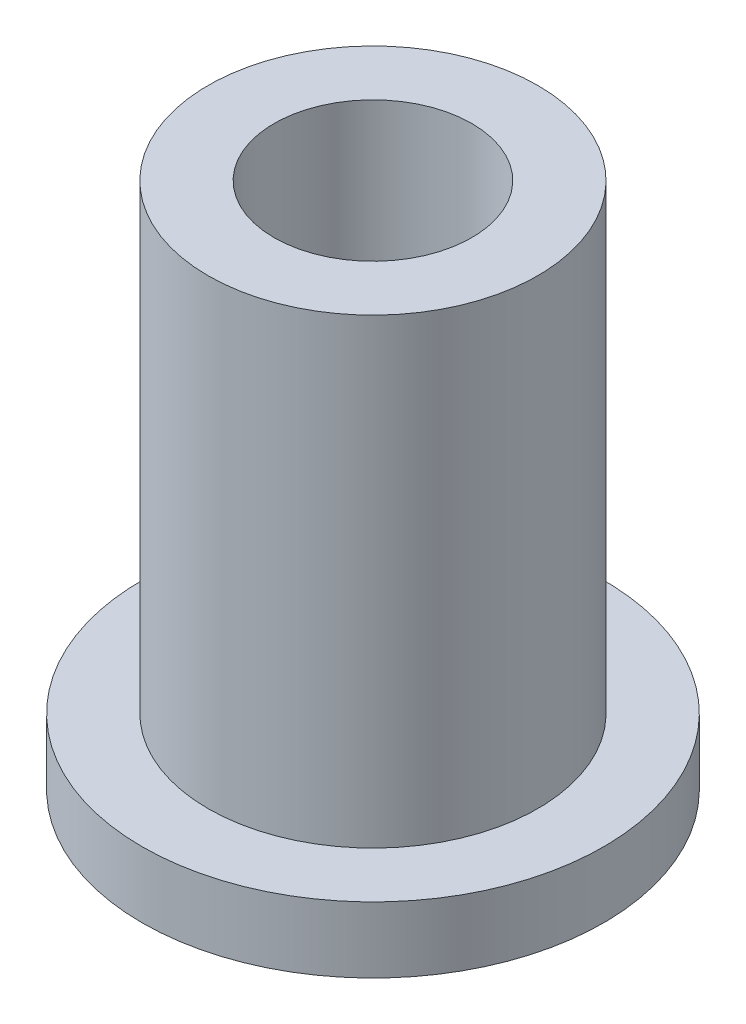
ISO-10303-21;
HEADER;
FILE_DESCRIPTION(('STEP AP214'),'2;1');
FILE_NAME('part.step','',(''),(''),'','','');
FILE_SCHEMA(('AUTOMOTIVE_DESIGN { 1 0 10303 214 1 1 1 1 }'));
ENDSEC;
DATA;
#1=APPLICATION_CONTEXT('core data for automotive mechanical design processes');
#2=APPLICATION_PROTOCOL_DEFINITION('international standard','automotive_design',2000,#1);
#3=PRODUCT_CONTEXT('',#1,'mechanical');
#4=PRODUCT('Part','Part','',(#3));
#5=PRODUCT_RELATED_PRODUCT_CATEGORY('part','',(#4));
#6=PRODUCT_DEFINITION_FORMATION('','',#4);
#7=PRODUCT_DEFINITION_CONTEXT('part definition',#1,'design');
#8=PRODUCT_DEFINITION('design','',#6,#7);
#9=PRODUCT_DEFINITION_SHAPE('','',#8);
#10=(LENGTH_UNIT() NAMED_UNIT(*) SI_UNIT(.MILLI.,.METRE.));
#11=(NAMED_UNIT(*) PLANE_ANGLE_UNIT() SI_UNIT($,.RADIAN.));
#12=(NAMED_UNIT(*) SI_UNIT($,.STERADIAN.) SOLID_ANGLE_UNIT());
#13=UNCERTAINTY_MEASURE_WITH_UNIT(LENGTH_MEASURE(1.E-05),#10,'distance_accuracy_value','');
#14=(GEOMETRIC_REPRESENTATION_CONTEXT(3) GLOBAL_UNCERTAINTY_ASSIGNED_CONTEXT((#13)) GLOBAL_UNIT_ASSIGNED_CONTEXT((#10,
#11,#12)) REPRESENTATION_CONTEXT('',''));
#15=CARTESIAN_POINT('',(0.,0.,0.));
#16=DIRECTION('',(0.,0.,1.));
#17=DIRECTION('',(1.,0.,0.));
#18=AXIS2_PLACEMENT_3D('',#15,#16,#17);
#19=CARTESIAN_POINT('',(0.,1.5875,0.));
#20=DIRECTION('',(0.,1.,0.));
#21=DIRECTION('',(0.,0.,1.));
#22=AXIS2_PLACEMENT_3D('',#19,#20,#21);
#23=PLANE('',#22);
#24=CARTESIAN_POINT('',(0.,1.5875,0.));
#25=DIRECTION('',(0.,1.,0.));
#26=DIRECTION('',(0.,0.,1.));
#27=AXIS2_PLACEMENT_3D('',#24,#25,#26);
#28=CIRCLE('',#27,5.55625);
#29=CARTESIAN_POINT('',(0.,1.5875,5.55625));
#30=VERTEX_POINT('',#29);
#31=EDGE_CURVE('E10',#30,#30,#28,.T.);
#32=ORIENTED_EDGE('',*,*,#31,.T.);
#33=EDGE_LOOP('',(#32));
#34=FACE_BOUND('',#33,.T.);
#35=CARTESIAN_POINT('',(0.,1.5875,0.));
#36=DIRECTION('',(0.,1.,0.));
#37=DIRECTION('',(0.,0.,1.));
#38=AXIS2_PLACEMENT_3D('',#35,#36,#37);
#39=CIRCLE('',#38,3.96875);
#40=CARTESIAN_POINT('',(0.,1.5875,3.96875));
#41=VERTEX_POINT('',#40);
#42=EDGE_CURVE('E47',#41,#41,#39,.T.);
#43=ORIENTED_EDGE('',*,*,#42,.F.);
#44=EDGE_LOOP('',(#43));
#45=FACE_BOUND('',#44,.T.);
#46=ADVANCED_FACE('F31',(#34,#45),#23,.T.);
#47=CARTESIAN_POINT('',(0.,0.,0.));
#48=DIRECTION('',(0.,1.,0.));
#49=DIRECTION('',(0.,0.,1.));
#50=AXIS2_PLACEMENT_3D('',#47,#48,#49);
#51=PLANE('',#50);
#52=CARTESIAN_POINT('',(0.,0.,0.));
#53=DIRECTION('',(0.,1.,0.));
#54=DIRECTION('',(0.,0.,1.));
#55=AXIS2_PLACEMENT_3D('',#52,#53,#54);
#56=CIRCLE('',#55,5.55625);
#57=CARTESIAN_POINT('',(0.,0.,5.55625));
#58=VERTEX_POINT('',#57);
#59=EDGE_CURVE('E35',#58,#58,#56,.T.);
#60=ORIENTED_EDGE('',*,*,#59,.F.);
#61=EDGE_LOOP('',(#60));
#62=FACE_BOUND('',#61,.T.);
#63=CARTESIAN_POINT('',(0.,0.,0.));
#64=DIRECTION('',(0.,1.,0.));
#65=DIRECTION('',(0.,0.,1.));
#66=AXIS2_PLACEMENT_3D('',#63,#64,#65);
#67=CIRCLE('',#66,2.38125);
#68=CARTESIAN_POINT('',(0.,0.,2.38125));
#69=VERTEX_POINT('',#68);
#70=EDGE_CURVE('E42',#69,#69,#67,.T.);
#71=ORIENTED_EDGE('',*,*,#70,.T.);
#72=EDGE_LOOP('',(#71));
#73=FACE_BOUND('',#72,.T.);
#74=ADVANCED_FACE('F72',(#62,#73),#51,.F.);
#75=CARTESIAN_POINT('',(0.,1.5875,0.));
#76=DIRECTION('',(0.,-1.,0.));
#77=DIRECTION('',(0.,0.,-1.));
#78=AXIS2_PLACEMENT_3D('',#75,#76,#77);
#79=CYLINDRICAL_SURFACE('',#78,5.55625);
#80=ORIENTED_EDGE('',*,*,#31,.F.);
#81=EDGE_LOOP('',(#80));
#82=FACE_BOUND('',#81,.T.);
#83=ORIENTED_EDGE('',*,*,#59,.T.);
#84=EDGE_LOOP('',(#83));
#85=FACE_BOUND('',#84,.T.);
#86=ADVANCED_FACE('F33',(#82,#85),#79,.T.);
#87=CARTESIAN_POINT('',(0.,1.5875,0.));
#88=DIRECTION('',(0.,-1.,0.));
#89=DIRECTION('',(0.,0.,-1.));
#90=AXIS2_PLACEMENT_3D('',#87,#88,#89);
#91=CYLINDRICAL_SURFACE('',#90,2.38125);
#92=ORIENTED_EDGE('',*,*,#70,.F.);
#93=EDGE_LOOP('',(#92));
#94=FACE_BOUND('',#93,.T.);
#95=CARTESIAN_POINT('',(0.,12.7,0.));
#96=DIRECTION('',(0.,1.,0.));
#97=DIRECTION('',(0.,0.,1.));
#98=AXIS2_PLACEMENT_3D('',#95,#96,#97);
#99=CIRCLE('',#98,2.38125);
#100=CARTESIAN_POINT('',(0.,12.7,2.38125));
#101=VERTEX_POINT('',#100);
#102=EDGE_CURVE('E50',#101,#101,#99,.T.);
#103=ORIENTED_EDGE('',*,*,#102,.T.);
#104=EDGE_LOOP('',(#103));
#105=FACE_BOUND('',#104,.T.);
#106=ADVANCED_FACE('F56',(#94,#105),#91,.F.);
#107=CARTESIAN_POINT('',(0.,12.7,0.));
#108=DIRECTION('',(0.,1.,0.));
#109=DIRECTION('',(0.,0.,1.));
#110=AXIS2_PLACEMENT_3D('',#107,#108,#109);
#111=PLANE('',#110);
#112=CARTESIAN_POINT('',(0.,12.7,0.));
#113=DIRECTION('',(0.,1.,0.));
#114=DIRECTION('',(0.,0.,1.));
#115=AXIS2_PLACEMENT_3D('',#112,#113,#114);
#116=CIRCLE('',#115,3.96875);
#117=CARTESIAN_POINT('',(0.,12.7,3.96875));
#118=VERTEX_POINT('',#117);
#119=EDGE_CURVE('E46',#118,#118,#116,.T.);
#120=ORIENTED_EDGE('',*,*,#119,.T.);
#121=EDGE_LOOP('',(#120));
#122=FACE_BOUND('',#121,.T.);
#123=ORIENTED_EDGE('',*,*,#102,.F.);
#124=EDGE_LOOP('',(#123));
#125=FACE_BOUND('',#124,.T.);
#126=ADVANCED_FACE('F58',(#122,#125),#111,.T.);
#127=CARTESIAN_POINT('',(0.,12.7,0.));
#128=DIRECTION('',(0.,-1.,0.));
#129=DIRECTION('',(0.,0.,-1.));
#130=AXIS2_PLACEMENT_3D('',#127,#128,#129);
#131=CYLINDRICAL_SURFACE('',#130,3.96875);
#132=ORIENTED_EDGE('',*,*,#119,.F.);
#133=EDGE_LOOP('',(#132));
#134=FACE_BOUND('',#133,.T.);
#135=ORIENTED_EDGE('',*,*,#42,.T.);
#136=EDGE_LOOP('',(#135));
#137=FACE_BOUND('',#136,.T.);
#138=ADVANCED_FACE('F60',(#134,#137),#131,.T.);
#139=CLOSED_SHELL('',(#46,#74,#86,#106,#126,#138));
#140=MANIFOLD_SOLID_BREP('B2',#139);
#141=ADVANCED_BREP_SHAPE_REPRESENTATION('',(#18,#140),#14);
#142=SHAPE_DEFINITION_REPRESENTATION(#9,#141);
ENDSEC;
END-ISO-10303-21;
